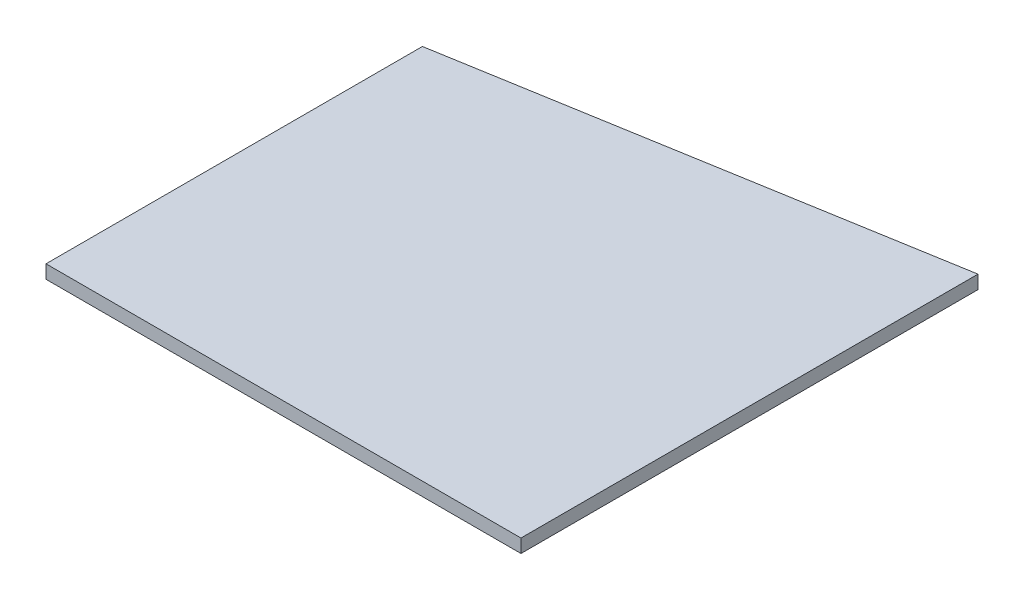
ISO-10303-21;
HEADER;
FILE_DESCRIPTION(('STEP AP214'),'2;1');
FILE_NAME('part.step','',(''),(''),'','','');
FILE_SCHEMA(('AUTOMOTIVE_DESIGN { 1 0 10303 214 1 1 1 1 }'));
ENDSEC;
DATA;
#1=APPLICATION_CONTEXT('core data for automotive mechanical design processes');
#2=APPLICATION_PROTOCOL_DEFINITION('international standard','automotive_design',2000,#1);
#3=PRODUCT_CONTEXT('',#1,'mechanical');
#4=PRODUCT('Part','Part','',(#3));
#5=PRODUCT_RELATED_PRODUCT_CATEGORY('part','',(#4));
#6=PRODUCT_DEFINITION_FORMATION('','',#4);
#7=PRODUCT_DEFINITION_CONTEXT('part definition',#1,'design');
#8=PRODUCT_DEFINITION('design','',#6,#7);
#9=PRODUCT_DEFINITION_SHAPE('','',#8);
#10=(LENGTH_UNIT() NAMED_UNIT(*) SI_UNIT(.MILLI.,.METRE.));
#11=(NAMED_UNIT(*) PLANE_ANGLE_UNIT() SI_UNIT($,.RADIAN.));
#12=(NAMED_UNIT(*) SI_UNIT($,.STERADIAN.) SOLID_ANGLE_UNIT());
#13=UNCERTAINTY_MEASURE_WITH_UNIT(LENGTH_MEASURE(1.E-05),#10,'distance_accuracy_value','');
#14=(GEOMETRIC_REPRESENTATION_CONTEXT(3) GLOBAL_UNCERTAINTY_ASSIGNED_CONTEXT((#13)) GLOBAL_UNIT_ASSIGNED_CONTEXT((#10,
#11,#12)) REPRESENTATION_CONTEXT('',''));
#15=CARTESIAN_POINT('',(0.,0.,0.));
#16=DIRECTION('',(0.,0.,1.));
#17=DIRECTION('',(1.,0.,0.));
#18=AXIS2_PLACEMENT_3D('',#15,#16,#17);
#19=CARTESIAN_POINT('',(-31.8996138996139,1.5,-15.7123552123552));
#20=DIRECTION('',(0.167414699655973,0.,0.98588656464073));
#21=DIRECTION('',(0.98588656464073,0.,-0.167414699655973));
#22=AXIS2_PLACEMENT_3D('',#19,#20,#21);
#23=PLANE('',#22);
#24=DIRECTION('',(-0.98588656464073,0.,0.167414699655973));
#25=VECTOR('',#24,1.);
#26=CARTESIAN_POINT('',(-31.8996138996139,0.,-15.7123552123552));
#27=LINE('',#26,#25);
#28=CARTESIAN_POINT('',(21.1003861003861,0.,-24.7123552123552));
#29=VERTEX_POINT('',#28);
#30=CARTESIAN_POINT('',(-31.8996138996139,0.,-15.7123552123552));
#31=VERTEX_POINT('',#30);
#32=EDGE_CURVE('E95',#29,#31,#27,.T.);
#33=ORIENTED_EDGE('',*,*,#32,.T.);
#34=DIRECTION('',(0.,-1.,0.));
#35=VECTOR('',#34,1.);
#36=CARTESIAN_POINT('',(-31.8996138996139,1.5,-15.7123552123552));
#37=LINE('',#36,#35);
#38=CARTESIAN_POINT('',(-31.8996138996139,1.5,-15.7123552123552));
#39=VERTEX_POINT('',#38);
#40=EDGE_CURVE('E11',#39,#31,#37,.T.);
#41=ORIENTED_EDGE('',*,*,#40,.F.);
#42=DIRECTION('',(-0.98588656464073,0.,0.167414699655973));
#43=VECTOR('',#42,1.);
#44=CARTESIAN_POINT('',(-31.8996138996139,1.5,-15.7123552123552));
#45=LINE('',#44,#43);
#46=CARTESIAN_POINT('',(21.1003861003861,1.5,-24.7123552123552));
#47=VERTEX_POINT('',#46);
#48=EDGE_CURVE('E83',#47,#39,#45,.T.);
#49=ORIENTED_EDGE('',*,*,#48,.F.);
#50=DIRECTION('',(0.,-1.,0.));
#51=VECTOR('',#50,1.);
#52=CARTESIAN_POINT('',(21.1003861003861,1.5,-24.7123552123552));
#53=LINE('',#52,#51);
#54=EDGE_CURVE('E91',#47,#29,#53,.T.);
#55=ORIENTED_EDGE('',*,*,#54,.T.);
#56=EDGE_LOOP('',(#33,#41,#49,#55));
#57=FACE_BOUND('',#56,.T.);
#58=ADVANCED_FACE('F32',(#57),#23,.F.);
#59=CARTESIAN_POINT('',(-31.8996138996139,1.5,26.2876447876448));
#60=DIRECTION('',(1.,0.,0.));
#61=DIRECTION('',(0.,0.,-1.));
#62=AXIS2_PLACEMENT_3D('',#59,#60,#61);
#63=PLANE('',#62);
#64=DIRECTION('',(0.,0.,1.));
#65=VECTOR('',#64,1.);
#66=CARTESIAN_POINT('',(-31.8996138996139,0.,26.2876447876448));
#67=LINE('',#66,#65);
#68=CARTESIAN_POINT('',(-31.8996138996139,0.,26.2876447876448));
#69=VERTEX_POINT('',#68);
#70=EDGE_CURVE('E87',#31,#69,#67,.T.);
#71=ORIENTED_EDGE('',*,*,#70,.T.);
#72=DIRECTION('',(0.,-1.,0.));
#73=VECTOR('',#72,1.);
#74=CARTESIAN_POINT('',(-31.8996138996139,1.5,26.2876447876448));
#75=LINE('',#74,#73);
#76=CARTESIAN_POINT('',(-31.8996138996139,1.5,26.2876447876448));
#77=VERTEX_POINT('',#76);
#78=EDGE_CURVE('E40',#77,#69,#75,.T.);
#79=ORIENTED_EDGE('',*,*,#78,.F.);
#80=DIRECTION('',(0.,0.,1.));
#81=VECTOR('',#80,1.);
#82=CARTESIAN_POINT('',(-31.8996138996139,1.5,26.2876447876448));
#83=LINE('',#82,#81);
#84=EDGE_CURVE('E78',#39,#77,#83,.T.);
#85=ORIENTED_EDGE('',*,*,#84,.F.);
#86=ORIENTED_EDGE('',*,*,#40,.T.);
#87=EDGE_LOOP('',(#71,#79,#85,#86));
#88=FACE_BOUND('',#87,.T.);
#89=ADVANCED_FACE('F86',(#88),#63,.F.);
#90=CARTESIAN_POINT('',(21.1003861003861,1.5,26.2876447876448));
#91=DIRECTION('',(0.,0.,-1.));
#92=DIRECTION('',(-1.,0.,0.));
#93=AXIS2_PLACEMENT_3D('',#90,#91,#92);
#94=PLANE('',#93);
#95=DIRECTION('',(1.,0.,0.));
#96=VECTOR('',#95,1.);
#97=CARTESIAN_POINT('',(21.1003861003861,0.,26.2876447876448));
#98=LINE('',#97,#96);
#99=CARTESIAN_POINT('',(21.1003861003861,0.,26.2876447876448));
#100=VERTEX_POINT('',#99);
#101=EDGE_CURVE('E65',#69,#100,#98,.T.);
#102=ORIENTED_EDGE('',*,*,#101,.T.);
#103=DIRECTION('',(0.,-1.,0.));
#104=VECTOR('',#103,1.);
#105=CARTESIAN_POINT('',(21.1003861003861,1.5,26.2876447876448));
#106=LINE('',#105,#104);
#107=CARTESIAN_POINT('',(21.1003861003861,1.5,26.2876447876448));
#108=VERTEX_POINT('',#107);
#109=EDGE_CURVE('E88',#108,#100,#106,.T.);
#110=ORIENTED_EDGE('',*,*,#109,.F.);
#111=DIRECTION('',(1.,0.,0.));
#112=VECTOR('',#111,1.);
#113=CARTESIAN_POINT('',(21.1003861003861,1.5,26.2876447876448));
#114=LINE('',#113,#112);
#115=EDGE_CURVE('E81',#77,#108,#114,.T.);
#116=ORIENTED_EDGE('',*,*,#115,.F.);
#117=ORIENTED_EDGE('',*,*,#78,.T.);
#118=EDGE_LOOP('',(#102,#110,#116,#117));
#119=FACE_BOUND('',#118,.T.);
#120=ADVANCED_FACE('F89',(#119),#94,.F.);
#121=CARTESIAN_POINT('',(21.1003861003861,1.5,-24.7123552123552));
#122=DIRECTION('',(-1.,0.,0.));
#123=DIRECTION('',(0.,0.,1.));
#124=AXIS2_PLACEMENT_3D('',#121,#122,#123);
#125=PLANE('',#124);
#126=DIRECTION('',(0.,0.,-1.));
#127=VECTOR('',#126,1.);
#128=CARTESIAN_POINT('',(21.1003861003861,0.,-24.7123552123552));
#129=LINE('',#128,#127);
#130=EDGE_CURVE('E71',#100,#29,#129,.T.);
#131=ORIENTED_EDGE('',*,*,#130,.T.);
#132=ORIENTED_EDGE('',*,*,#54,.F.);
#133=DIRECTION('',(0.,0.,-1.));
#134=VECTOR('',#133,1.);
#135=CARTESIAN_POINT('',(21.1003861003861,1.5,-24.7123552123552));
#136=LINE('',#135,#134);
#137=EDGE_CURVE('E48',#108,#47,#136,.T.);
#138=ORIENTED_EDGE('',*,*,#137,.F.);
#139=ORIENTED_EDGE('',*,*,#109,.T.);
#140=EDGE_LOOP('',(#131,#132,#138,#139));
#141=FACE_BOUND('',#140,.T.);
#142=ADVANCED_FACE('F102',(#141),#125,.F.);
#143=CARTESIAN_POINT('',(0.,1.5,0.));
#144=DIRECTION('',(0.,-1.,0.));
#145=DIRECTION('',(0.,0.,-1.));
#146=AXIS2_PLACEMENT_3D('',#143,#144,#145);
#147=PLANE('',#146);
#148=ORIENTED_EDGE('',*,*,#48,.T.);
#149=ORIENTED_EDGE('',*,*,#84,.T.);
#150=ORIENTED_EDGE('',*,*,#115,.T.);
#151=ORIENTED_EDGE('',*,*,#137,.T.);
#152=EDGE_LOOP('',(#148,#149,#150,#151));
#153=FACE_BOUND('',#152,.T.);
#154=ADVANCED_FACE('F79',(#153),#147,.F.);
#155=CARTESIAN_POINT('',(0.,0.,0.));
#156=DIRECTION('',(0.,-1.,0.));
#157=DIRECTION('',(0.,0.,-1.));
#158=AXIS2_PLACEMENT_3D('',#155,#156,#157);
#159=PLANE('',#158);
#160=ORIENTED_EDGE('',*,*,#32,.F.);
#161=ORIENTED_EDGE('',*,*,#130,.F.);
#162=ORIENTED_EDGE('',*,*,#101,.F.);
#163=ORIENTED_EDGE('',*,*,#70,.F.);
#164=EDGE_LOOP('',(#160,#161,#162,#163));
#165=FACE_BOUND('',#164,.T.);
#166=ADVANCED_FACE('F105',(#165),#159,.T.);
#167=CLOSED_SHELL('',(#58,#89,#120,#142,#154,#166));
#168=MANIFOLD_SOLID_BREP('B2',#167);
#169=ADVANCED_BREP_SHAPE_REPRESENTATION('',(#18,#168),#14);
#170=SHAPE_DEFINITION_REPRESENTATION(#9,#169);
ENDSEC;
END-ISO-10303-21;
